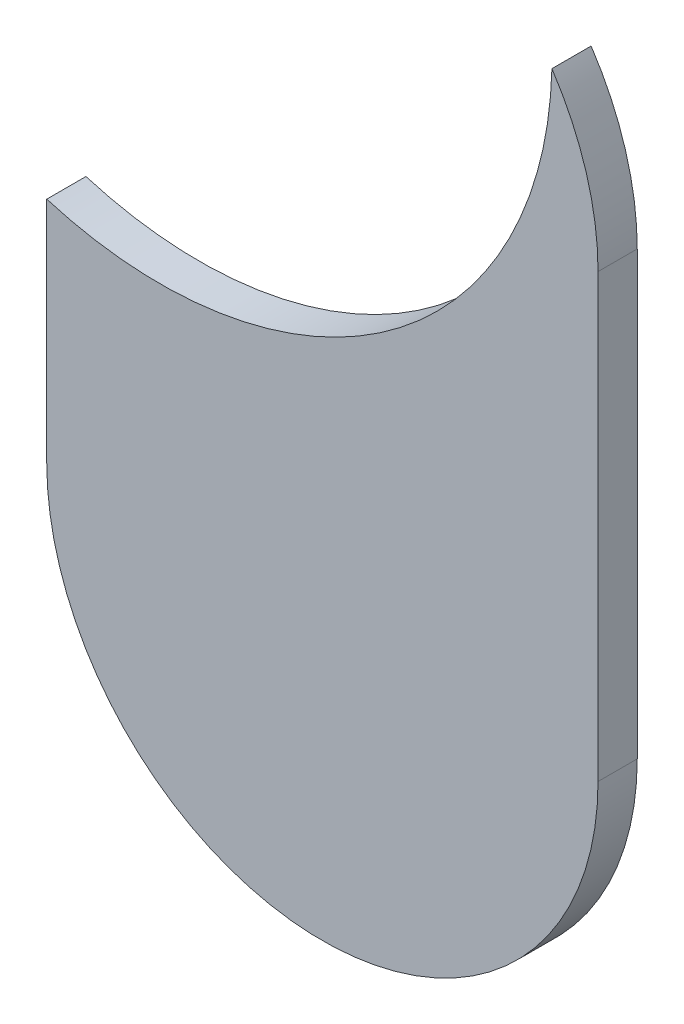
ISO-10303-21;
HEADER;
FILE_DESCRIPTION(('STEP AP214'),'2;1');
FILE_NAME('part.step','',(''),(''),'','','');
FILE_SCHEMA(('AUTOMOTIVE_DESIGN { 1 0 10303 214 1 1 1 1 }'));
ENDSEC;
DATA;
#1=APPLICATION_CONTEXT('core data for automotive mechanical design processes');
#2=APPLICATION_PROTOCOL_DEFINITION('international standard','automotive_design',2000,#1);
#3=PRODUCT_CONTEXT('',#1,'mechanical');
#4=PRODUCT('Part','Part','',(#3));
#5=PRODUCT_RELATED_PRODUCT_CATEGORY('part','',(#4));
#6=PRODUCT_DEFINITION_FORMATION('','',#4);
#7=PRODUCT_DEFINITION_CONTEXT('part definition',#1,'design');
#8=PRODUCT_DEFINITION('design','',#6,#7);
#9=PRODUCT_DEFINITION_SHAPE('','',#8);
#10=(LENGTH_UNIT() NAMED_UNIT(*) SI_UNIT(.MILLI.,.METRE.));
#11=(NAMED_UNIT(*) PLANE_ANGLE_UNIT() SI_UNIT($,.RADIAN.));
#12=(NAMED_UNIT(*) SI_UNIT($,.STERADIAN.) SOLID_ANGLE_UNIT());
#13=UNCERTAINTY_MEASURE_WITH_UNIT(LENGTH_MEASURE(1.E-05),#10,'distance_accuracy_value','');
#14=(GEOMETRIC_REPRESENTATION_CONTEXT(3) GLOBAL_UNCERTAINTY_ASSIGNED_CONTEXT((#13)) GLOBAL_UNIT_ASSIGNED_CONTEXT((#10,
#11,#12)) REPRESENTATION_CONTEXT('',''));
#15=CARTESIAN_POINT('',(0.,0.,0.));
#16=DIRECTION('',(0.,0.,1.));
#17=DIRECTION('',(1.,0.,0.));
#18=AXIS2_PLACEMENT_3D('',#15,#16,#17);
#19=CARTESIAN_POINT('',(87.79733266,108.45213768,0.));
#20=DIRECTION('',(-1.,0.,0.));
#21=DIRECTION('',(0.,1.,0.));
#22=AXIS2_PLACEMENT_3D('',#19,#20,#21);
#23=PLANE('',#22);
#24=DIRECTION('',(0.,1.,0.));
#25=VECTOR('',#24,1.);
#26=CARTESIAN_POINT('',(87.79733266,108.45213768,0.03556));
#27=LINE('',#26,#25);
#28=CARTESIAN_POINT('',(87.79733266,108.45213768,0.03556));
#29=VERTEX_POINT('',#28);
#30=CARTESIAN_POINT('',(87.79733266,108.85266774,0.03556));
#31=VERTEX_POINT('',#30);
#32=EDGE_CURVE('E11',#29,#31,#27,.T.);
#33=ORIENTED_EDGE('',*,*,#32,.F.);
#34=DIRECTION('',(0.,0.,1.));
#35=VECTOR('',#34,1.);
#36=CARTESIAN_POINT('',(87.79733266,108.45213768,0.));
#37=LINE('',#36,#35);
#38=CARTESIAN_POINT('',(87.79733266,108.45213768,0.));
#39=VERTEX_POINT('',#38);
#40=EDGE_CURVE('E24',#39,#29,#37,.T.);
#41=ORIENTED_EDGE('',*,*,#40,.F.);
#42=DIRECTION('',(0.,1.,0.));
#43=VECTOR('',#42,1.);
#44=CARTESIAN_POINT('',(87.79733266,108.45213768,0.));
#45=LINE('',#44,#43);
#46=CARTESIAN_POINT('',(87.79733266,108.85266774,0.));
#47=VERTEX_POINT('',#46);
#48=EDGE_CURVE('E82',#39,#47,#45,.T.);
#49=ORIENTED_EDGE('',*,*,#48,.T.);
#50=DIRECTION('',(0.,0.,1.));
#51=VECTOR('',#50,1.);
#52=CARTESIAN_POINT('',(87.79733266,108.85266774,0.));
#53=LINE('',#52,#51);
#54=EDGE_CURVE('E37',#47,#31,#53,.T.);
#55=ORIENTED_EDGE('',*,*,#54,.T.);
#56=EDGE_LOOP('',(#33,#41,#49,#55));
#57=FACE_BOUND('',#56,.T.);
#58=ADVANCED_FACE('F17',(#57),#23,.F.);
#59=CARTESIAN_POINT('',(87.54733316,108.85266774,0.));
#60=DIRECTION('',(0.,0.,-1.));
#61=DIRECTION('',(1.,0.,0.));
#62=AXIS2_PLACEMENT_3D('',#59,#60,#61);
#63=CYLINDRICAL_SURFACE('',#62,0.249999500000006);
#64=CARTESIAN_POINT('',(87.54733316,108.85266774,0.03556));
#65=DIRECTION('',(0.,0.,1.));
#66=DIRECTION('',(1.,0.,0.));
#67=AXIS2_PLACEMENT_3D('',#64,#65,#66);
#68=CIRCLE('',#67,0.249999500000006);
#69=CARTESIAN_POINT('',(87.7554896988026,108.991125695185,0.03556));
#70=VERTEX_POINT('',#69);
#71=EDGE_CURVE('E98',#31,#70,#68,.T.);
#72=ORIENTED_EDGE('',*,*,#71,.F.);
#73=ORIENTED_EDGE('',*,*,#54,.F.);
#74=CARTESIAN_POINT('',(87.54733316,108.85266774,0.));
#75=DIRECTION('',(0.,0.,1.));
#76=DIRECTION('',(1.,0.,0.));
#77=AXIS2_PLACEMENT_3D('',#74,#75,#76);
#78=CIRCLE('',#77,0.249999500000006);
#79=CARTESIAN_POINT('',(87.7554896988026,108.991125695185,0.));
#80=VERTEX_POINT('',#79);
#81=EDGE_CURVE('E95',#47,#80,#78,.T.);
#82=ORIENTED_EDGE('',*,*,#81,.T.);
#83=DIRECTION('',(0.,0.,1.));
#84=VECTOR('',#83,1.);
#85=CARTESIAN_POINT('',(87.7554896988026,108.991125695185,0.));
#86=LINE('',#85,#84);
#87=EDGE_CURVE('E93',#80,#70,#86,.T.);
#88=ORIENTED_EDGE('',*,*,#87,.T.);
#89=EDGE_LOOP('',(#72,#73,#82,#88));
#90=FACE_BOUND('',#89,.T.);
#91=ADVANCED_FACE('F104',(#90),#63,.T.);
#92=CARTESIAN_POINT('',(87.40000046,109.00000044,0.));
#93=DIRECTION('',(0.,0.,-1.));
#94=DIRECTION('',(1.,0.,0.));
#95=AXIS2_PLACEMENT_3D('',#92,#93,#94);
#96=CYLINDRICAL_SURFACE('',#95,0.3556);
#97=DIRECTION('',(0.,0.,1.));
#98=VECTOR('',#97,1.);
#99=CARTESIAN_POINT('',(87.29733366,108.659543558475,0.));
#100=LINE('',#99,#98);
#101=CARTESIAN_POINT('',(87.29733366,108.659543558475,0.));
#102=VERTEX_POINT('',#101);
#103=CARTESIAN_POINT('',(87.29733366,108.659543558475,0.03556));
#104=VERTEX_POINT('',#103);
#105=EDGE_CURVE('E73',#102,#104,#100,.T.);
#106=ORIENTED_EDGE('',*,*,#105,.T.);
#107=CARTESIAN_POINT('',(87.40000046,109.00000044,0.03556));
#108=DIRECTION('',(0.,0.,1.));
#109=DIRECTION('',(1.,0.,0.));
#110=AXIS2_PLACEMENT_3D('',#107,#108,#109);
#111=CIRCLE('',#110,0.3556);
#112=EDGE_CURVE('E89',#104,#70,#111,.T.);
#113=ORIENTED_EDGE('',*,*,#112,.T.);
#114=ORIENTED_EDGE('',*,*,#87,.F.);
#115=CARTESIAN_POINT('',(87.40000046,109.00000044,0.));
#116=DIRECTION('',(0.,0.,1.));
#117=DIRECTION('',(1.,0.,0.));
#118=AXIS2_PLACEMENT_3D('',#115,#116,#117);
#119=CIRCLE('',#118,0.3556);
#120=EDGE_CURVE('E87',#102,#80,#119,.T.);
#121=ORIENTED_EDGE('',*,*,#120,.F.);
#122=EDGE_LOOP('',(#106,#113,#114,#121));
#123=FACE_BOUND('',#122,.T.);
#124=ADVANCED_FACE('F109',(#123),#96,.F.);
#125=CARTESIAN_POINT('',(87.29733366,108.659543558475,0.));
#126=DIRECTION('',(1.,0.,0.));
#127=DIRECTION('',(0.,-1.,0.));
#128=AXIS2_PLACEMENT_3D('',#125,#126,#127);
#129=PLANE('',#128);
#130=DIRECTION('',(0.,-1.,0.));
#131=VECTOR('',#130,1.);
#132=CARTESIAN_POINT('',(87.29733366,108.85266774,0.03556));
#133=LINE('',#132,#131);
#134=CARTESIAN_POINT('',(87.29733366,108.45213768,0.03556));
#135=VERTEX_POINT('',#134);
#136=EDGE_CURVE('E77',#104,#135,#133,.T.);
#137=ORIENTED_EDGE('',*,*,#136,.F.);
#138=ORIENTED_EDGE('',*,*,#105,.F.);
#139=DIRECTION('',(0.,-1.,0.));
#140=VECTOR('',#139,1.);
#141=CARTESIAN_POINT('',(87.29733366,108.85266774,0.));
#142=LINE('',#141,#140);
#143=CARTESIAN_POINT('',(87.29733366,108.45213768,0.));
#144=VERTEX_POINT('',#143);
#145=EDGE_CURVE('E69',#102,#144,#142,.T.);
#146=ORIENTED_EDGE('',*,*,#145,.T.);
#147=DIRECTION('',(0.,0.,1.));
#148=VECTOR('',#147,1.);
#149=CARTESIAN_POINT('',(87.29733366,108.45213768,0.));
#150=LINE('',#149,#148);
#151=EDGE_CURVE('E59',#144,#135,#150,.T.);
#152=ORIENTED_EDGE('',*,*,#151,.T.);
#153=EDGE_LOOP('',(#137,#138,#146,#152));
#154=FACE_BOUND('',#153,.T.);
#155=ADVANCED_FACE('F72',(#154),#129,.F.);
#156=CARTESIAN_POINT('',(87.54733316,108.45213768,0.));
#157=DIRECTION('',(0.,0.,-1.));
#158=DIRECTION('',(-1.,0.,0.));
#159=AXIS2_PLACEMENT_3D('',#156,#157,#158);
#160=CYLINDRICAL_SURFACE('',#159,0.249999500000001);
#161=CARTESIAN_POINT('',(87.54733316,108.45213768,0.03556));
#162=DIRECTION('',(0.,0.,1.));
#163=DIRECTION('',(-1.,0.,0.));
#164=AXIS2_PLACEMENT_3D('',#161,#162,#163);
#165=CIRCLE('',#164,0.249999500000001);
#166=EDGE_CURVE('E65',#135,#29,#165,.T.);
#167=ORIENTED_EDGE('',*,*,#166,.F.);
#168=ORIENTED_EDGE('',*,*,#151,.F.);
#169=CARTESIAN_POINT('',(87.54733316,108.45213768,0.));
#170=DIRECTION('',(0.,0.,1.));
#171=DIRECTION('',(-1.,0.,0.));
#172=AXIS2_PLACEMENT_3D('',#169,#170,#171);
#173=CIRCLE('',#172,0.249999500000001);
#174=EDGE_CURVE('E63',#144,#39,#173,.T.);
#175=ORIENTED_EDGE('',*,*,#174,.T.);
#176=ORIENTED_EDGE('',*,*,#40,.T.);
#177=EDGE_LOOP('',(#167,#168,#175,#176));
#178=FACE_BOUND('',#177,.T.);
#179=ADVANCED_FACE('F61',(#178),#160,.T.);
#180=CARTESIAN_POINT('',(87.79733266,108.45213768,0.));
#181=DIRECTION('',(0.,0.,-1.));
#182=DIRECTION('',(-1.,0.,0.));
#183=AXIS2_PLACEMENT_3D('',#180,#181,#182);
#184=PLANE('',#183);
#185=ORIENTED_EDGE('',*,*,#48,.F.);
#186=ORIENTED_EDGE('',*,*,#174,.F.);
#187=ORIENTED_EDGE('',*,*,#145,.F.);
#188=ORIENTED_EDGE('',*,*,#120,.T.);
#189=ORIENTED_EDGE('',*,*,#81,.F.);
#190=EDGE_LOOP('',(#185,#186,#187,#188,#189));
#191=FACE_BOUND('',#190,.T.);
#192=ADVANCED_FACE('F80',(#191),#184,.T.);
#193=CARTESIAN_POINT('',(87.79733266,108.45213768,0.03556));
#194=DIRECTION('',(0.,0.,-1.));
#195=DIRECTION('',(-1.,0.,0.));
#196=AXIS2_PLACEMENT_3D('',#193,#194,#195);
#197=PLANE('',#196);
#198=ORIENTED_EDGE('',*,*,#166,.T.);
#199=ORIENTED_EDGE('',*,*,#32,.T.);
#200=ORIENTED_EDGE('',*,*,#71,.T.);
#201=ORIENTED_EDGE('',*,*,#112,.F.);
#202=ORIENTED_EDGE('',*,*,#136,.T.);
#203=EDGE_LOOP('',(#198,#199,#200,#201,#202));
#204=FACE_BOUND('',#203,.T.);
#205=ADVANCED_FACE('F107',(#204),#197,.F.);
#206=CLOSED_SHELL('',(#58,#91,#124,#155,#179,#192,#205));
#207=MANIFOLD_SOLID_BREP('B1',#206);
#208=ADVANCED_BREP_SHAPE_REPRESENTATION('',(#18,#207),#14);
#209=SHAPE_DEFINITION_REPRESENTATION(#9,#208);
ENDSEC;
END-ISO-10303-21;
